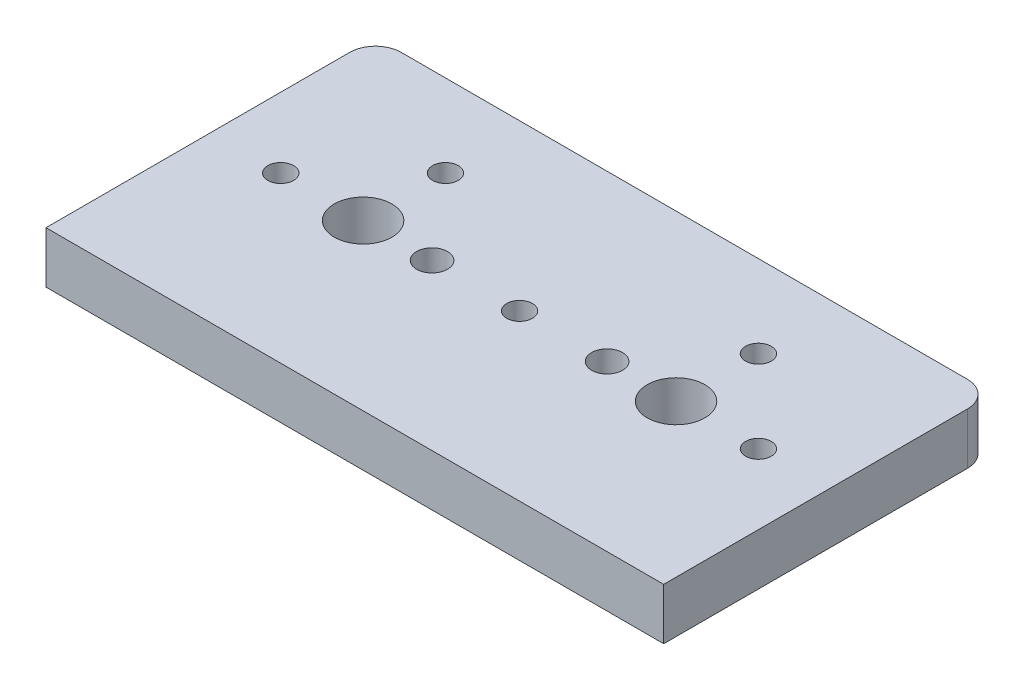
ISO-10303-21;
HEADER;
FILE_DESCRIPTION(('STEP AP214'),'2;1');
FILE_NAME('part.step','',(''),(''),'','','');
FILE_SCHEMA(('AUTOMOTIVE_DESIGN { 1 0 10303 214 1 1 1 1 }'));
ENDSEC;
DATA;
#1=APPLICATION_CONTEXT('core data for automotive mechanical design processes');
#2=APPLICATION_PROTOCOL_DEFINITION('international standard','automotive_design',2000,#1);
#3=PRODUCT_CONTEXT('',#1,'mechanical');
#4=PRODUCT('Part','Part','',(#3));
#5=PRODUCT_RELATED_PRODUCT_CATEGORY('part','',(#4));
#6=PRODUCT_DEFINITION_FORMATION('','',#4);
#7=PRODUCT_DEFINITION_CONTEXT('part definition',#1,'design');
#8=PRODUCT_DEFINITION('design','',#6,#7);
#9=PRODUCT_DEFINITION_SHAPE('','',#8);
#10=(LENGTH_UNIT() NAMED_UNIT(*) SI_UNIT(.MILLI.,.METRE.));
#11=(NAMED_UNIT(*) PLANE_ANGLE_UNIT() SI_UNIT($,.RADIAN.));
#12=(NAMED_UNIT(*) SI_UNIT($,.STERADIAN.) SOLID_ANGLE_UNIT());
#13=UNCERTAINTY_MEASURE_WITH_UNIT(LENGTH_MEASURE(1.E-05),#10,'distance_accuracy_value','');
#14=(GEOMETRIC_REPRESENTATION_CONTEXT(3) GLOBAL_UNCERTAINTY_ASSIGNED_CONTEXT((#13)) GLOBAL_UNIT_ASSIGNED_CONTEXT((#10,
#11,#12)) REPRESENTATION_CONTEXT('',''));
#15=CARTESIAN_POINT('',(0.,0.,0.));
#16=DIRECTION('',(0.,0.,1.));
#17=DIRECTION('',(1.,0.,0.));
#18=AXIS2_PLACEMENT_3D('',#15,#16,#17);
#19=CARTESIAN_POINT('',(0.,5.,0.));
#20=DIRECTION('',(0.,-1.,0.));
#21=DIRECTION('',(0.,0.,-1.));
#22=AXIS2_PLACEMENT_3D('',#19,#20,#21);
#23=PLANE('',#22);
#24=CARTESIAN_POINT('',(0.,5.,0.));
#25=DIRECTION('',(0.,1.,0.));
#26=DIRECTION('',(0.,0.,1.));
#27=AXIS2_PLACEMENT_3D('',#24,#25,#26);
#28=CIRCLE('',#27,1.25);
#29=CARTESIAN_POINT('',(0.,5.,1.25));
#30=VERTEX_POINT('',#29);
#31=EDGE_CURVE('E177',#30,#30,#28,.T.);
#32=ORIENTED_EDGE('',*,*,#31,.F.);
#33=EDGE_LOOP('',(#32));
#34=FACE_BOUND('',#33,.T.);
#35=CARTESIAN_POINT('',(-15.2,5.,-8.));
#36=DIRECTION('',(0.,-1.,0.));
#37=DIRECTION('',(0.,0.,-1.));
#38=AXIS2_PLACEMENT_3D('',#35,#36,#37);
#39=CIRCLE('',#38,1.25);
#40=CARTESIAN_POINT('',(-15.2,5.,-9.25));
#41=VERTEX_POINT('',#40);
#42=EDGE_CURVE('E171',#41,#41,#39,.T.);
#43=ORIENTED_EDGE('',*,*,#42,.T.);
#44=EDGE_LOOP('',(#43));
#45=FACE_BOUND('',#44,.T.);
#46=CARTESIAN_POINT('',(-23.2,5.,0.));
#47=DIRECTION('',(0.,-1.,0.));
#48=DIRECTION('',(0.,0.,-1.));
#49=AXIS2_PLACEMENT_3D('',#46,#47,#48);
#50=CIRCLE('',#49,1.25);
#51=CARTESIAN_POINT('',(-23.2,5.,-1.25));
#52=VERTEX_POINT('',#51);
#53=EDGE_CURVE('E163',#52,#52,#50,.T.);
#54=ORIENTED_EDGE('',*,*,#53,.T.);
#55=EDGE_LOOP('',(#54));
#56=FACE_BOUND('',#55,.T.);
#57=CARTESIAN_POINT('',(23.2,5.,0.));
#58=DIRECTION('',(0.,1.,0.));
#59=DIRECTION('',(0.,0.,1.));
#60=AXIS2_PLACEMENT_3D('',#57,#58,#59);
#61=CIRCLE('',#60,1.25);
#62=CARTESIAN_POINT('',(23.2,5.,1.25));
#63=VERTEX_POINT('',#62);
#64=EDGE_CURVE('E187',#63,#63,#61,.T.);
#65=ORIENTED_EDGE('',*,*,#64,.F.);
#66=EDGE_LOOP('',(#65));
#67=FACE_BOUND('',#66,.T.);
#68=DIRECTION('',(1.,0.,0.));
#69=VECTOR('',#68,1.);
#70=CARTESIAN_POINT('',(-30.,5.,-16.));
#71=LINE('',#70,#69);
#72=CARTESIAN_POINT('',(-27.5,5.,-16.));
#73=VERTEX_POINT('',#72);
#74=CARTESIAN_POINT('',(27.5,5.,-16.));
#75=VERTEX_POINT('',#74);
#76=EDGE_CURVE('E100',#73,#75,#71,.T.);
#77=ORIENTED_EDGE('',*,*,#76,.F.);
#78=CARTESIAN_POINT('',(-27.5,5.,-13.5));
#79=DIRECTION('',(0.,-1.,0.));
#80=DIRECTION('',(0.,0.,-1.));
#81=AXIS2_PLACEMENT_3D('',#78,#79,#80);
#82=CIRCLE('',#81,2.5);
#83=CARTESIAN_POINT('',(-30.,5.,-13.5));
#84=VERTEX_POINT('',#83);
#85=EDGE_CURVE('E51',#73,#84,#82,.F.);
#86=ORIENTED_EDGE('',*,*,#85,.T.);
#87=DIRECTION('',(0.,0.,1.));
#88=VECTOR('',#87,1.);
#89=CARTESIAN_POINT('',(-30.,5.,-16.));
#90=LINE('',#89,#88);
#91=CARTESIAN_POINT('',(-30.,5.,16.));
#92=VERTEX_POINT('',#91);
#93=EDGE_CURVE('E106',#84,#92,#90,.T.);
#94=ORIENTED_EDGE('',*,*,#93,.T.);
#95=DIRECTION('',(1.,0.,0.));
#96=VECTOR('',#95,1.);
#97=CARTESIAN_POINT('',(-30.,5.,16.));
#98=LINE('',#97,#96);
#99=CARTESIAN_POINT('',(30.,5.,16.));
#100=VERTEX_POINT('',#99);
#101=EDGE_CURVE('E101',#92,#100,#98,.T.);
#102=ORIENTED_EDGE('',*,*,#101,.T.);
#103=DIRECTION('',(0.,0.,1.));
#104=VECTOR('',#103,1.);
#105=CARTESIAN_POINT('',(30.,5.,-16.));
#106=LINE('',#105,#104);
#107=CARTESIAN_POINT('',(30.,5.,-13.5));
#108=VERTEX_POINT('',#107);
#109=EDGE_CURVE('E94',#108,#100,#106,.T.);
#110=ORIENTED_EDGE('',*,*,#109,.F.);
#111=CARTESIAN_POINT('',(27.5,5.,-13.5));
#112=DIRECTION('',(0.,-1.,0.));
#113=DIRECTION('',(0.,0.,-1.));
#114=AXIS2_PLACEMENT_3D('',#111,#112,#113);
#115=CIRCLE('',#114,2.5);
#116=EDGE_CURVE('E63',#108,#75,#115,.F.);
#117=ORIENTED_EDGE('',*,*,#116,.T.);
#118=EDGE_LOOP('',(#77,#86,#94,#102,#110,#117));
#119=FACE_BOUND('',#118,.T.);
#120=CARTESIAN_POINT('',(-8.5,5.,0.));
#121=DIRECTION('',(0.,-1.,0.));
#122=DIRECTION('',(0.,0.,-1.));
#123=AXIS2_PLACEMENT_3D('',#120,#121,#122);
#124=CIRCLE('',#123,1.5);
#125=CARTESIAN_POINT('',(-8.5,5.,-1.5));
#126=VERTEX_POINT('',#125);
#127=EDGE_CURVE('E159',#126,#126,#124,.T.);
#128=ORIENTED_EDGE('',*,*,#127,.T.);
#129=EDGE_LOOP('',(#128));
#130=FACE_BOUND('',#129,.T.);
#131=CARTESIAN_POINT('',(15.2,5.,-8.));
#132=DIRECTION('',(0.,1.,0.));
#133=DIRECTION('',(0.,0.,1.));
#134=AXIS2_PLACEMENT_3D('',#131,#132,#133);
#135=CIRCLE('',#134,1.25);
#136=CARTESIAN_POINT('',(15.2,5.,-6.75));
#137=VERTEX_POINT('',#136);
#138=EDGE_CURVE('E170',#137,#137,#135,.T.);
#139=ORIENTED_EDGE('',*,*,#138,.F.);
#140=EDGE_LOOP('',(#139));
#141=FACE_BOUND('',#140,.T.);
#142=CARTESIAN_POINT('',(-15.2,5.,0.));
#143=DIRECTION('',(0.,-1.,0.));
#144=DIRECTION('',(0.,0.,-1.));
#145=AXIS2_PLACEMENT_3D('',#142,#143,#144);
#146=CIRCLE('',#145,2.8);
#147=CARTESIAN_POINT('',(-15.2,5.,-2.8));
#148=VERTEX_POINT('',#147);
#149=EDGE_CURVE('E194',#148,#148,#146,.T.);
#150=ORIENTED_EDGE('',*,*,#149,.T.);
#151=EDGE_LOOP('',(#150));
#152=FACE_BOUND('',#151,.T.);
#153=CARTESIAN_POINT('',(15.2,5.,0.));
#154=DIRECTION('',(0.,1.,0.));
#155=DIRECTION('',(0.,0.,1.));
#156=AXIS2_PLACEMENT_3D('',#153,#154,#155);
#157=CIRCLE('',#156,2.8);
#158=CARTESIAN_POINT('',(15.2,5.,2.8));
#159=VERTEX_POINT('',#158);
#160=EDGE_CURVE('E199',#159,#159,#157,.T.);
#161=ORIENTED_EDGE('',*,*,#160,.F.);
#162=EDGE_LOOP('',(#161));
#163=FACE_BOUND('',#162,.T.);
#164=CARTESIAN_POINT('',(8.5,5.,0.));
#165=DIRECTION('',(0.,1.,0.));
#166=DIRECTION('',(0.,0.,1.));
#167=AXIS2_PLACEMENT_3D('',#164,#165,#166);
#168=CIRCLE('',#167,1.5);
#169=CARTESIAN_POINT('',(8.5,5.,1.5));
#170=VERTEX_POINT('',#169);
#171=EDGE_CURVE('E162',#170,#170,#168,.T.);
#172=ORIENTED_EDGE('',*,*,#171,.F.);
#173=EDGE_LOOP('',(#172));
#174=FACE_BOUND('',#173,.T.);
#175=ADVANCED_FACE('F43',(#34,#45,#56,#67,#119,#130,#141,#152,#163,#174),#23,.F.);
#176=CARTESIAN_POINT('',(0.,0.,0.));
#177=DIRECTION('',(0.,-1.,0.));
#178=DIRECTION('',(0.,0.,-1.));
#179=AXIS2_PLACEMENT_3D('',#176,#177,#178);
#180=PLANE('',#179);
#181=CARTESIAN_POINT('',(-15.2,0.,-8.));
#182=DIRECTION('',(0.,-1.,0.));
#183=DIRECTION('',(0.,0.,-1.));
#184=AXIS2_PLACEMENT_3D('',#181,#182,#183);
#185=CIRCLE('',#184,1.25);
#186=CARTESIAN_POINT('',(-15.2,0.,-9.25));
#187=VERTEX_POINT('',#186);
#188=EDGE_CURVE('E166',#187,#187,#185,.T.);
#189=ORIENTED_EDGE('',*,*,#188,.F.);
#190=EDGE_LOOP('',(#189));
#191=FACE_BOUND('',#190,.T.);
#192=CARTESIAN_POINT('',(-23.2,0.,0.));
#193=DIRECTION('',(0.,-1.,0.));
#194=DIRECTION('',(0.,0.,-1.));
#195=AXIS2_PLACEMENT_3D('',#192,#193,#194);
#196=CIRCLE('',#195,1.25);
#197=CARTESIAN_POINT('',(-23.2,0.,-1.25));
#198=VERTEX_POINT('',#197);
#199=EDGE_CURVE('E167',#198,#198,#196,.T.);
#200=ORIENTED_EDGE('',*,*,#199,.F.);
#201=EDGE_LOOP('',(#200));
#202=FACE_BOUND('',#201,.T.);
#203=CARTESIAN_POINT('',(-15.2,0.,0.));
#204=DIRECTION('',(0.,-1.,0.));
#205=DIRECTION('',(0.,0.,-1.));
#206=AXIS2_PLACEMENT_3D('',#203,#204,#205);
#207=CIRCLE('',#206,2.8);
#208=CARTESIAN_POINT('',(-15.2,0.,-2.8));
#209=VERTEX_POINT('',#208);
#210=EDGE_CURVE('E202',#209,#209,#207,.T.);
#211=ORIENTED_EDGE('',*,*,#210,.F.);
#212=EDGE_LOOP('',(#211));
#213=FACE_BOUND('',#212,.T.);
#214=CARTESIAN_POINT('',(-8.5,0.,0.));
#215=DIRECTION('',(0.,-1.,0.));
#216=DIRECTION('',(0.,0.,-1.));
#217=AXIS2_PLACEMENT_3D('',#214,#215,#216);
#218=CIRCLE('',#217,1.5);
#219=CARTESIAN_POINT('',(-8.5,0.,-1.5));
#220=VERTEX_POINT('',#219);
#221=EDGE_CURVE('E154',#220,#220,#218,.T.);
#222=ORIENTED_EDGE('',*,*,#221,.F.);
#223=EDGE_LOOP('',(#222));
#224=FACE_BOUND('',#223,.T.);
#225=DIRECTION('',(0.,0.,1.));
#226=VECTOR('',#225,1.);
#227=CARTESIAN_POINT('',(-30.,0.,-16.));
#228=LINE('',#227,#226);
#229=CARTESIAN_POINT('',(-30.,0.,-13.5));
#230=VERTEX_POINT('',#229);
#231=CARTESIAN_POINT('',(-30.,0.,16.));
#232=VERTEX_POINT('',#231);
#233=EDGE_CURVE('E110',#230,#232,#228,.T.);
#234=ORIENTED_EDGE('',*,*,#233,.F.);
#235=CARTESIAN_POINT('',(-27.5,0.,-13.5));
#236=DIRECTION('',(0.,-1.,0.));
#237=DIRECTION('',(0.,0.,-1.));
#238=AXIS2_PLACEMENT_3D('',#235,#236,#237);
#239=CIRCLE('',#238,2.5);
#240=CARTESIAN_POINT('',(-27.5,0.,-16.));
#241=VERTEX_POINT('',#240);
#242=EDGE_CURVE('E125',#230,#241,#239,.T.);
#243=ORIENTED_EDGE('',*,*,#242,.T.);
#244=DIRECTION('',(1.,0.,0.));
#245=VECTOR('',#244,1.);
#246=CARTESIAN_POINT('',(-30.,0.,-16.));
#247=LINE('',#246,#245);
#248=CARTESIAN_POINT('',(27.5,0.,-16.));
#249=VERTEX_POINT('',#248);
#250=EDGE_CURVE('E146',#241,#249,#247,.T.);
#251=ORIENTED_EDGE('',*,*,#250,.T.);
#252=CARTESIAN_POINT('',(27.5,0.,-13.5));
#253=DIRECTION('',(0.,-1.,0.));
#254=DIRECTION('',(0.,0.,-1.));
#255=AXIS2_PLACEMENT_3D('',#252,#253,#254);
#256=CIRCLE('',#255,2.5);
#257=CARTESIAN_POINT('',(30.,0.,-13.5));
#258=VERTEX_POINT('',#257);
#259=EDGE_CURVE('E119',#249,#258,#256,.T.);
#260=ORIENTED_EDGE('',*,*,#259,.T.);
#261=DIRECTION('',(0.,0.,1.));
#262=VECTOR('',#261,1.);
#263=CARTESIAN_POINT('',(30.,0.,-16.));
#264=LINE('',#263,#262);
#265=CARTESIAN_POINT('',(30.,0.,16.));
#266=VERTEX_POINT('',#265);
#267=EDGE_CURVE('E150',#258,#266,#264,.T.);
#268=ORIENTED_EDGE('',*,*,#267,.T.);
#269=DIRECTION('',(1.,0.,0.));
#270=VECTOR('',#269,1.);
#271=CARTESIAN_POINT('',(-30.,0.,16.));
#272=LINE('',#271,#270);
#273=EDGE_CURVE('E114',#232,#266,#272,.T.);
#274=ORIENTED_EDGE('',*,*,#273,.F.);
#275=EDGE_LOOP('',(#234,#243,#251,#260,#268,#274));
#276=FACE_BOUND('',#275,.T.);
#277=CARTESIAN_POINT('',(15.2,0.,-8.));
#278=DIRECTION('',(0.,-1.,0.));
#279=DIRECTION('',(0.,0.,-1.));
#280=AXIS2_PLACEMENT_3D('',#277,#278,#279);
#281=CIRCLE('',#280,1.25);
#282=CARTESIAN_POINT('',(15.2,0.,-9.25));
#283=VERTEX_POINT('',#282);
#284=EDGE_CURVE('E190',#283,#283,#281,.F.);
#285=ORIENTED_EDGE('',*,*,#284,.T.);
#286=EDGE_LOOP('',(#285));
#287=FACE_BOUND('',#286,.T.);
#288=CARTESIAN_POINT('',(23.2,0.,0.));
#289=DIRECTION('',(0.,-1.,0.));
#290=DIRECTION('',(0.,0.,-1.));
#291=AXIS2_PLACEMENT_3D('',#288,#289,#290);
#292=CIRCLE('',#291,1.25);
#293=CARTESIAN_POINT('',(23.2,0.,-1.25));
#294=VERTEX_POINT('',#293);
#295=EDGE_CURVE('E191',#294,#294,#292,.F.);
#296=ORIENTED_EDGE('',*,*,#295,.T.);
#297=EDGE_LOOP('',(#296));
#298=FACE_BOUND('',#297,.T.);
#299=CARTESIAN_POINT('',(15.2,0.,0.));
#300=DIRECTION('',(0.,-1.,0.));
#301=DIRECTION('',(0.,0.,-1.));
#302=AXIS2_PLACEMENT_3D('',#299,#300,#301);
#303=CIRCLE('',#302,2.8);
#304=CARTESIAN_POINT('',(15.2,0.,-2.8));
#305=VERTEX_POINT('',#304);
#306=EDGE_CURVE('E203',#305,#305,#303,.F.);
#307=ORIENTED_EDGE('',*,*,#306,.T.);
#308=EDGE_LOOP('',(#307));
#309=FACE_BOUND('',#308,.T.);
#310=CARTESIAN_POINT('',(0.,0.,0.));
#311=DIRECTION('',(0.,-1.,0.));
#312=DIRECTION('',(0.,0.,-1.));
#313=AXIS2_PLACEMENT_3D('',#310,#311,#312);
#314=CIRCLE('',#313,1.25);
#315=CARTESIAN_POINT('',(0.,0.,-1.25));
#316=VERTEX_POINT('',#315);
#317=EDGE_CURVE('E174',#316,#316,#314,.F.);
#318=ORIENTED_EDGE('',*,*,#317,.T.);
#319=EDGE_LOOP('',(#318));
#320=FACE_BOUND('',#319,.T.);
#321=CARTESIAN_POINT('',(8.5,0.,0.));
#322=DIRECTION('',(0.,-1.,0.));
#323=DIRECTION('',(0.,0.,-1.));
#324=AXIS2_PLACEMENT_3D('',#321,#322,#323);
#325=CIRCLE('',#324,1.5);
#326=CARTESIAN_POINT('',(8.5,0.,-1.5));
#327=VERTEX_POINT('',#326);
#328=EDGE_CURVE('E180',#327,#327,#325,.F.);
#329=ORIENTED_EDGE('',*,*,#328,.T.);
#330=EDGE_LOOP('',(#329));
#331=FACE_BOUND('',#330,.T.);
#332=ADVANCED_FACE('F144',(#191,#202,#213,#224,#276,#287,#298,#309,#320,#331),#180,.T.);
#333=CARTESIAN_POINT('',(-30.,5.,16.));
#334=DIRECTION('',(0.,0.,-1.));
#335=DIRECTION('',(-1.,0.,0.));
#336=AXIS2_PLACEMENT_3D('',#333,#334,#335);
#337=PLANE('',#336);
#338=ORIENTED_EDGE('',*,*,#273,.T.);
#339=DIRECTION('',(0.,-1.,0.));
#340=VECTOR('',#339,1.);
#341=CARTESIAN_POINT('',(30.,5.,16.));
#342=LINE('',#341,#340);
#343=EDGE_CURVE('E98',#100,#266,#342,.T.);
#344=ORIENTED_EDGE('',*,*,#343,.F.);
#345=ORIENTED_EDGE('',*,*,#101,.F.);
#346=DIRECTION('',(0.,-1.,0.));
#347=VECTOR('',#346,1.);
#348=CARTESIAN_POINT('',(-30.,5.,16.));
#349=LINE('',#348,#347);
#350=EDGE_CURVE('E116',#92,#232,#349,.T.);
#351=ORIENTED_EDGE('',*,*,#350,.T.);
#352=EDGE_LOOP('',(#338,#344,#345,#351));
#353=FACE_BOUND('',#352,.T.);
#354=ADVANCED_FACE('F112',(#353),#337,.F.);
#355=CARTESIAN_POINT('',(30.,5.,-16.));
#356=DIRECTION('',(1.,0.,0.));
#357=DIRECTION('',(0.,0.,-1.));
#358=AXIS2_PLACEMENT_3D('',#355,#356,#357);
#359=PLANE('',#358);
#360=ORIENTED_EDGE('',*,*,#267,.F.);
#361=DIRECTION('',(0.,-1.,0.));
#362=VECTOR('',#361,1.);
#363=CARTESIAN_POINT('',(30.,5.,-13.5));
#364=LINE('',#363,#362);
#365=EDGE_CURVE('E11',#258,#108,#364,.F.);
#366=ORIENTED_EDGE('',*,*,#365,.T.);
#367=ORIENTED_EDGE('',*,*,#109,.T.);
#368=ORIENTED_EDGE('',*,*,#343,.T.);
#369=EDGE_LOOP('',(#360,#366,#367,#368));
#370=FACE_BOUND('',#369,.T.);
#371=ADVANCED_FACE('F96',(#370),#359,.T.);
#372=CARTESIAN_POINT('',(-30.,5.,-16.));
#373=DIRECTION('',(0.,0.,-1.));
#374=DIRECTION('',(-1.,0.,0.));
#375=AXIS2_PLACEMENT_3D('',#372,#373,#374);
#376=PLANE('',#375);
#377=ORIENTED_EDGE('',*,*,#250,.F.);
#378=DIRECTION('',(0.,-1.,0.));
#379=VECTOR('',#378,1.);
#380=CARTESIAN_POINT('',(-27.5,5.,-16.));
#381=LINE('',#380,#379);
#382=EDGE_CURVE('E130',#241,#73,#381,.F.);
#383=ORIENTED_EDGE('',*,*,#382,.T.);
#384=ORIENTED_EDGE('',*,*,#76,.T.);
#385=DIRECTION('',(0.,-1.,0.));
#386=VECTOR('',#385,1.);
#387=CARTESIAN_POINT('',(27.5,5.,-16.));
#388=LINE('',#387,#386);
#389=EDGE_CURVE('E127',#75,#249,#388,.T.);
#390=ORIENTED_EDGE('',*,*,#389,.T.);
#391=EDGE_LOOP('',(#377,#383,#384,#390));
#392=FACE_BOUND('',#391,.T.);
#393=ADVANCED_FACE('F148',(#392),#376,.T.);
#394=CARTESIAN_POINT('',(-30.,5.,-16.));
#395=DIRECTION('',(1.,0.,0.));
#396=DIRECTION('',(0.,0.,-1.));
#397=AXIS2_PLACEMENT_3D('',#394,#395,#396);
#398=PLANE('',#397);
#399=ORIENTED_EDGE('',*,*,#93,.F.);
#400=DIRECTION('',(0.,-1.,0.));
#401=VECTOR('',#400,1.);
#402=CARTESIAN_POINT('',(-30.,0.,-13.5));
#403=LINE('',#402,#401);
#404=EDGE_CURVE('E115',#84,#230,#403,.T.);
#405=ORIENTED_EDGE('',*,*,#404,.T.);
#406=ORIENTED_EDGE('',*,*,#233,.T.);
#407=ORIENTED_EDGE('',*,*,#350,.F.);
#408=EDGE_LOOP('',(#399,#405,#406,#407));
#409=FACE_BOUND('',#408,.T.);
#410=ADVANCED_FACE('F137',(#409),#398,.F.);
#411=CARTESIAN_POINT('',(-8.5,-7.91959594928934,0.));
#412=DIRECTION('',(0.,1.,0.));
#413=DIRECTION('',(0.,0.,1.));
#414=AXIS2_PLACEMENT_3D('',#411,#412,#413);
#415=CYLINDRICAL_SURFACE('',#414,1.5);
#416=ORIENTED_EDGE('',*,*,#127,.F.);
#417=EDGE_LOOP('',(#416));
#418=FACE_BOUND('',#417,.T.);
#419=ORIENTED_EDGE('',*,*,#221,.T.);
#420=EDGE_LOOP('',(#419));
#421=FACE_BOUND('',#420,.T.);
#422=ADVANCED_FACE('F219',(#418,#421),#415,.F.);
#423=CARTESIAN_POINT('',(15.2,-7.91959594928934,-8.));
#424=DIRECTION('',(0.,1.,0.));
#425=DIRECTION('',(0.,0.,1.));
#426=AXIS2_PLACEMENT_3D('',#423,#424,#425);
#427=CYLINDRICAL_SURFACE('',#426,1.25);
#428=ORIENTED_EDGE('',*,*,#138,.T.);
#429=EDGE_LOOP('',(#428));
#430=FACE_BOUND('',#429,.T.);
#431=ORIENTED_EDGE('',*,*,#284,.F.);
#432=EDGE_LOOP('',(#431));
#433=FACE_BOUND('',#432,.T.);
#434=ADVANCED_FACE('F221',(#430,#433),#427,.F.);
#435=CARTESIAN_POINT('',(23.2,-7.91959594928934,0.));
#436=DIRECTION('',(0.,1.,0.));
#437=DIRECTION('',(0.,0.,1.));
#438=AXIS2_PLACEMENT_3D('',#435,#436,#437);
#439=CYLINDRICAL_SURFACE('',#438,1.25);
#440=ORIENTED_EDGE('',*,*,#64,.T.);
#441=EDGE_LOOP('',(#440));
#442=FACE_BOUND('',#441,.T.);
#443=ORIENTED_EDGE('',*,*,#295,.F.);
#444=EDGE_LOOP('',(#443));
#445=FACE_BOUND('',#444,.T.);
#446=ADVANCED_FACE('F228',(#442,#445),#439,.F.);
#447=CARTESIAN_POINT('',(-15.2,-7.91959594928934,0.));
#448=DIRECTION('',(0.,1.,0.));
#449=DIRECTION('',(0.,0.,1.));
#450=AXIS2_PLACEMENT_3D('',#447,#448,#449);
#451=CYLINDRICAL_SURFACE('',#450,2.8);
#452=ORIENTED_EDGE('',*,*,#149,.F.);
#453=EDGE_LOOP('',(#452));
#454=FACE_BOUND('',#453,.T.);
#455=ORIENTED_EDGE('',*,*,#210,.T.);
#456=EDGE_LOOP('',(#455));
#457=FACE_BOUND('',#456,.T.);
#458=ADVANCED_FACE('F211',(#454,#457),#451,.F.);
#459=CARTESIAN_POINT('',(15.2,-7.91959594928934,0.));
#460=DIRECTION('',(0.,1.,0.));
#461=DIRECTION('',(0.,0.,1.));
#462=AXIS2_PLACEMENT_3D('',#459,#460,#461);
#463=CYLINDRICAL_SURFACE('',#462,2.8);
#464=ORIENTED_EDGE('',*,*,#160,.T.);
#465=EDGE_LOOP('',(#464));
#466=FACE_BOUND('',#465,.T.);
#467=ORIENTED_EDGE('',*,*,#306,.F.);
#468=EDGE_LOOP('',(#467));
#469=FACE_BOUND('',#468,.T.);
#470=ADVANCED_FACE('F270',(#466,#469),#463,.F.);
#471=CARTESIAN_POINT('',(-23.2,-7.91959594928934,0.));
#472=DIRECTION('',(0.,1.,0.));
#473=DIRECTION('',(0.,0.,1.));
#474=AXIS2_PLACEMENT_3D('',#471,#472,#473);
#475=CYLINDRICAL_SURFACE('',#474,1.25);
#476=ORIENTED_EDGE('',*,*,#53,.F.);
#477=EDGE_LOOP('',(#476));
#478=FACE_BOUND('',#477,.T.);
#479=ORIENTED_EDGE('',*,*,#199,.T.);
#480=EDGE_LOOP('',(#479));
#481=FACE_BOUND('',#480,.T.);
#482=ADVANCED_FACE('F267',(#478,#481),#475,.F.);
#483=CARTESIAN_POINT('',(-15.2,-7.91959594928934,-8.));
#484=DIRECTION('',(0.,1.,0.));
#485=DIRECTION('',(0.,0.,1.));
#486=AXIS2_PLACEMENT_3D('',#483,#484,#485);
#487=CYLINDRICAL_SURFACE('',#486,1.25);
#488=ORIENTED_EDGE('',*,*,#42,.F.);
#489=EDGE_LOOP('',(#488));
#490=FACE_BOUND('',#489,.T.);
#491=ORIENTED_EDGE('',*,*,#188,.T.);
#492=EDGE_LOOP('',(#491));
#493=FACE_BOUND('',#492,.T.);
#494=ADVANCED_FACE('F260',(#490,#493),#487,.F.);
#495=CARTESIAN_POINT('',(0.,-7.91959594928934,0.));
#496=DIRECTION('',(0.,1.,0.));
#497=DIRECTION('',(0.,0.,1.));
#498=AXIS2_PLACEMENT_3D('',#495,#496,#497);
#499=CYLINDRICAL_SURFACE('',#498,1.25);
#500=ORIENTED_EDGE('',*,*,#31,.T.);
#501=EDGE_LOOP('',(#500));
#502=FACE_BOUND('',#501,.T.);
#503=ORIENTED_EDGE('',*,*,#317,.F.);
#504=EDGE_LOOP('',(#503));
#505=FACE_BOUND('',#504,.T.);
#506=ADVANCED_FACE('F254',(#502,#505),#499,.F.);
#507=CARTESIAN_POINT('',(8.5,-7.91959594928934,0.));
#508=DIRECTION('',(0.,1.,0.));
#509=DIRECTION('',(0.,0.,1.));
#510=AXIS2_PLACEMENT_3D('',#507,#508,#509);
#511=CYLINDRICAL_SURFACE('',#510,1.5);
#512=ORIENTED_EDGE('',*,*,#171,.T.);
#513=EDGE_LOOP('',(#512));
#514=FACE_BOUND('',#513,.T.);
#515=ORIENTED_EDGE('',*,*,#328,.F.);
#516=EDGE_LOOP('',(#515));
#517=FACE_BOUND('',#516,.T.);
#518=ADVANCED_FACE('F249',(#514,#517),#511,.F.);
#519=CARTESIAN_POINT('',(-27.5,5.,-13.5));
#520=DIRECTION('',(0.,1.,0.));
#521=DIRECTION('',(0.,0.,1.));
#522=AXIS2_PLACEMENT_3D('',#519,#520,#521);
#523=CYLINDRICAL_SURFACE('',#522,2.5);
#524=ORIENTED_EDGE('',*,*,#85,.F.);
#525=ORIENTED_EDGE('',*,*,#382,.F.);
#526=ORIENTED_EDGE('',*,*,#242,.F.);
#527=ORIENTED_EDGE('',*,*,#404,.F.);
#528=EDGE_LOOP('',(#524,#525,#526,#527));
#529=FACE_BOUND('',#528,.T.);
#530=ADVANCED_FACE('F140',(#529),#523,.T.);
#531=CARTESIAN_POINT('',(27.5,5.,-13.5));
#532=DIRECTION('',(0.,-1.,0.));
#533=DIRECTION('',(0.,0.,-1.));
#534=AXIS2_PLACEMENT_3D('',#531,#532,#533);
#535=CYLINDRICAL_SURFACE('',#534,2.5);
#536=ORIENTED_EDGE('',*,*,#116,.F.);
#537=ORIENTED_EDGE('',*,*,#365,.F.);
#538=ORIENTED_EDGE('',*,*,#259,.F.);
#539=ORIENTED_EDGE('',*,*,#389,.F.);
#540=EDGE_LOOP('',(#536,#537,#538,#539));
#541=FACE_BOUND('',#540,.T.);
#542=ADVANCED_FACE('F45',(#541),#535,.T.);
#543=CLOSED_SHELL('',(#175,#332,#354,#371,#393,#410,#422,#434,#446,#458,#470,#482,#494,#506,
#518,#530,#542));
#544=MANIFOLD_SOLID_BREP('B2',#543);
#545=ADVANCED_BREP_SHAPE_REPRESENTATION('',(#18,#544),#14);
#546=SHAPE_DEFINITION_REPRESENTATION(#9,#545);
ENDSEC;
END-ISO-10303-21;
